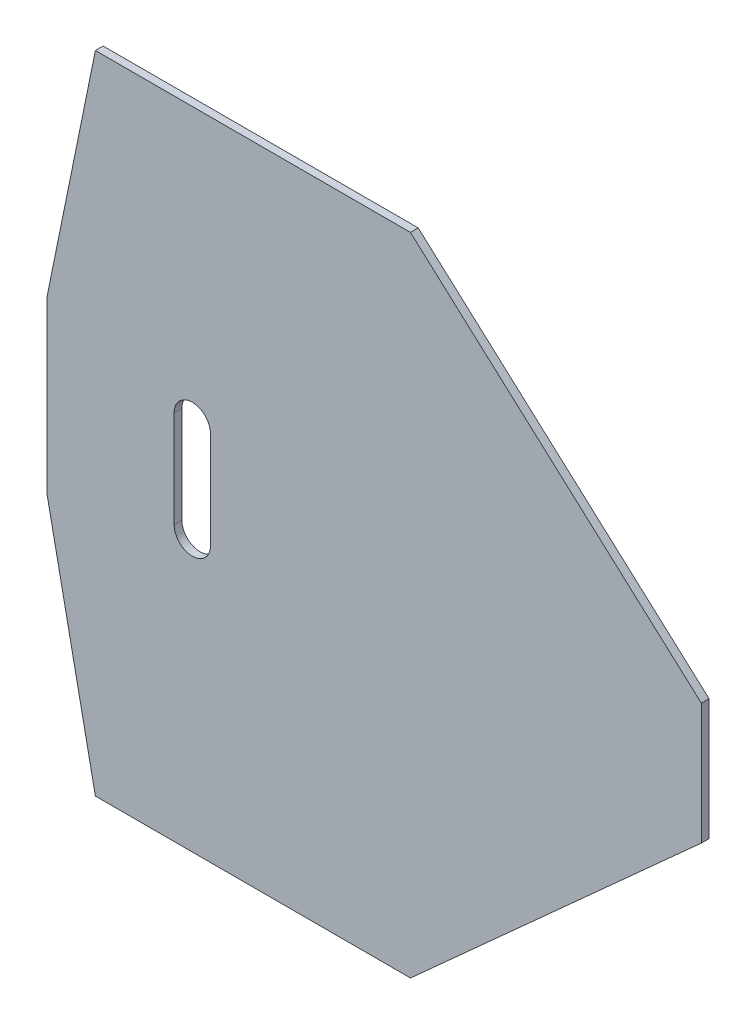
ISO-10303-21;
HEADER;
FILE_DESCRIPTION(('STEP AP214'),'2;1');
FILE_NAME('part.step','',(''),(''),'','','');
FILE_SCHEMA(('AUTOMOTIVE_DESIGN { 1 0 10303 214 1 1 1 1 }'));
ENDSEC;
DATA;
#1=APPLICATION_CONTEXT('core data for automotive mechanical design processes');
#2=APPLICATION_PROTOCOL_DEFINITION('international standard','automotive_design',2000,#1);
#3=PRODUCT_CONTEXT('',#1,'mechanical');
#4=PRODUCT('Part','Part','',(#3));
#5=PRODUCT_RELATED_PRODUCT_CATEGORY('part','',(#4));
#6=PRODUCT_DEFINITION_FORMATION('','',#4);
#7=PRODUCT_DEFINITION_CONTEXT('part definition',#1,'design');
#8=PRODUCT_DEFINITION('design','',#6,#7);
#9=PRODUCT_DEFINITION_SHAPE('','',#8);
#10=(LENGTH_UNIT() NAMED_UNIT(*) SI_UNIT(.MILLI.,.METRE.));
#11=(NAMED_UNIT(*) PLANE_ANGLE_UNIT() SI_UNIT($,.RADIAN.));
#12=(NAMED_UNIT(*) SI_UNIT($,.STERADIAN.) SOLID_ANGLE_UNIT());
#13=UNCERTAINTY_MEASURE_WITH_UNIT(LENGTH_MEASURE(1.E-05),#10,'distance_accuracy_value','');
#14=(GEOMETRIC_REPRESENTATION_CONTEXT(3) GLOBAL_UNCERTAINTY_ASSIGNED_CONTEXT((#13)) GLOBAL_UNIT_ASSIGNED_CONTEXT((#10,
#11,#12)) REPRESENTATION_CONTEXT('',''));
#15=CARTESIAN_POINT('',(0.,0.,0.));
#16=DIRECTION('',(0.,0.,1.));
#17=DIRECTION('',(1.,0.,0.));
#18=AXIS2_PLACEMENT_3D('',#15,#16,#17);
#19=CARTESIAN_POINT('',(190.,55.0000000000005,3.2));
#20=DIRECTION('',(-0.669648314373458,0.742678352355033,0.));
#21=DIRECTION('',(-0.742678352355033,-0.669648314373458,0.));
#22=AXIS2_PLACEMENT_3D('',#19,#20,#21);
#23=PLANE('',#22);
#24=DIRECTION('',(0.742678352355033,0.669648314373458,0.));
#25=VECTOR('',#24,1.);
#26=CARTESIAN_POINT('',(190.,55.0000000000005,0.));
#27=LINE('',#26,#25);
#28=CARTESIAN_POINT('',(69.9999999999996,-53.2000000000005,0.));
#29=VERTEX_POINT('',#28);
#30=CARTESIAN_POINT('',(190.,55.0000000000005,0.));
#31=VERTEX_POINT('',#30);
#32=EDGE_CURVE('E160',#29,#31,#27,.T.);
#33=ORIENTED_EDGE('',*,*,#32,.T.);
#34=DIRECTION('',(0.,0.,-1.));
#35=VECTOR('',#34,1.);
#36=CARTESIAN_POINT('',(190.,55.0000000000005,3.2));
#37=LINE('',#36,#35);
#38=CARTESIAN_POINT('',(190.,55.0000000000005,3.2));
#39=VERTEX_POINT('',#38);
#40=EDGE_CURVE('E11',#39,#31,#37,.T.);
#41=ORIENTED_EDGE('',*,*,#40,.F.);
#42=DIRECTION('',(0.742678352355033,0.669648314373458,0.));
#43=VECTOR('',#42,1.);
#44=CARTESIAN_POINT('',(190.,55.0000000000005,3.2));
#45=LINE('',#44,#43);
#46=CARTESIAN_POINT('',(69.9999999999996,-53.2000000000005,3.2));
#47=VERTEX_POINT('',#46);
#48=EDGE_CURVE('E164',#47,#39,#45,.T.);
#49=ORIENTED_EDGE('',*,*,#48,.F.);
#50=DIRECTION('',(0.,0.,-1.));
#51=VECTOR('',#50,1.);
#52=CARTESIAN_POINT('',(69.9999999999996,-53.2000000000005,3.2));
#53=LINE('',#52,#51);
#54=EDGE_CURVE('E182',#47,#29,#53,.T.);
#55=ORIENTED_EDGE('',*,*,#54,.T.);
#56=EDGE_LOOP('',(#33,#41,#49,#55));
#57=FACE_BOUND('',#56,.T.);
#58=ADVANCED_FACE('F39',(#57),#23,.F.);
#59=CARTESIAN_POINT('',(190.,55.0000000000005,3.2));
#60=DIRECTION('',(-1.,0.,0.));
#61=DIRECTION('',(0.,0.,1.));
#62=AXIS2_PLACEMENT_3D('',#59,#60,#61);
#63=PLANE('',#62);
#64=DIRECTION('',(0.,1.,0.));
#65=VECTOR('',#64,1.);
#66=CARTESIAN_POINT('',(190.,55.0000000000005,0.));
#67=LINE('',#66,#65);
#68=CARTESIAN_POINT('',(190.,105.000000000001,0.));
#69=VERTEX_POINT('',#68);
#70=EDGE_CURVE('E185',#31,#69,#67,.T.);
#71=ORIENTED_EDGE('',*,*,#70,.T.);
#72=DIRECTION('',(0.,0.,-1.));
#73=VECTOR('',#72,1.);
#74=CARTESIAN_POINT('',(190.,105.000000000001,3.2));
#75=LINE('',#74,#73);
#76=CARTESIAN_POINT('',(190.,105.000000000001,3.2));
#77=VERTEX_POINT('',#76);
#78=EDGE_CURVE('E46',#77,#69,#75,.T.);
#79=ORIENTED_EDGE('',*,*,#78,.F.);
#80=DIRECTION('',(0.,1.,0.));
#81=VECTOR('',#80,1.);
#82=CARTESIAN_POINT('',(190.,55.0000000000005,3.2));
#83=LINE('',#82,#81);
#84=EDGE_CURVE('E167',#39,#77,#83,.T.);
#85=ORIENTED_EDGE('',*,*,#84,.F.);
#86=ORIENTED_EDGE('',*,*,#40,.T.);
#87=EDGE_LOOP('',(#71,#79,#85,#86));
#88=FACE_BOUND('',#87,.T.);
#89=ADVANCED_FACE('F240',(#88),#63,.F.);
#90=CARTESIAN_POINT('',(70.0000000000015,213.2,3.2));
#91=DIRECTION('',(-0.669648314373456,-0.742678352355035,0.));
#92=DIRECTION('',(0.742678352355035,-0.669648314373456,0.));
#93=AXIS2_PLACEMENT_3D('',#90,#91,#92);
#94=PLANE('',#93);
#95=DIRECTION('',(-0.742678352355034,0.669648314373456,0.));
#96=VECTOR('',#95,1.);
#97=CARTESIAN_POINT('',(70.0000000000015,213.2,0.));
#98=LINE('',#97,#96);
#99=CARTESIAN_POINT('',(70.0000000000015,213.2,0.));
#100=VERTEX_POINT('',#99);
#101=EDGE_CURVE('E187',#69,#100,#98,.T.);
#102=ORIENTED_EDGE('',*,*,#101,.T.);
#103=DIRECTION('',(0.,0.,-1.));
#104=VECTOR('',#103,1.);
#105=CARTESIAN_POINT('',(70.0000000000015,213.2,3.2));
#106=LINE('',#105,#104);
#107=CARTESIAN_POINT('',(70.0000000000015,213.2,3.2));
#108=VERTEX_POINT('',#107);
#109=EDGE_CURVE('E212',#108,#100,#106,.T.);
#110=ORIENTED_EDGE('',*,*,#109,.F.);
#111=DIRECTION('',(-0.742678352355034,0.669648314373456,0.));
#112=VECTOR('',#111,1.);
#113=CARTESIAN_POINT('',(70.0000000000015,213.2,3.2));
#114=LINE('',#113,#112);
#115=EDGE_CURVE('E170',#77,#108,#114,.T.);
#116=ORIENTED_EDGE('',*,*,#115,.F.);
#117=ORIENTED_EDGE('',*,*,#78,.T.);
#118=EDGE_LOOP('',(#102,#110,#116,#117));
#119=FACE_BOUND('',#118,.T.);
#120=ADVANCED_FACE('F219',(#119),#94,.F.);
#121=CARTESIAN_POINT('',(-59.9999999999985,213.2,3.2));
#122=DIRECTION('',(0.,-1.,0.));
#123=DIRECTION('',(1.,0.,0.));
#124=AXIS2_PLACEMENT_3D('',#121,#122,#123);
#125=PLANE('',#124);
#126=DIRECTION('',(-1.,0.,0.));
#127=VECTOR('',#126,1.);
#128=CARTESIAN_POINT('',(-59.9999999999985,213.2,0.));
#129=LINE('',#128,#127);
#130=CARTESIAN_POINT('',(-59.9999999999985,213.2,0.));
#131=VERTEX_POINT('',#130);
#132=EDGE_CURVE('E189',#100,#131,#129,.T.);
#133=ORIENTED_EDGE('',*,*,#132,.T.);
#134=DIRECTION('',(0.,0.,-1.));
#135=VECTOR('',#134,1.);
#136=CARTESIAN_POINT('',(-59.9999999999985,213.2,3.2));
#137=LINE('',#136,#135);
#138=CARTESIAN_POINT('',(-59.9999999999985,213.2,3.2));
#139=VERTEX_POINT('',#138);
#140=EDGE_CURVE('E209',#139,#131,#137,.T.);
#141=ORIENTED_EDGE('',*,*,#140,.F.);
#142=DIRECTION('',(-1.,0.,0.));
#143=VECTOR('',#142,1.);
#144=CARTESIAN_POINT('',(-59.9999999999985,213.2,3.2));
#145=LINE('',#144,#143);
#146=EDGE_CURVE('E172',#108,#139,#145,.T.);
#147=ORIENTED_EDGE('',*,*,#146,.F.);
#148=ORIENTED_EDGE('',*,*,#109,.T.);
#149=EDGE_LOOP('',(#133,#141,#147,#148));
#150=FACE_BOUND('',#149,.T.);
#151=ADVANCED_FACE('F228',(#150),#125,.F.);
#152=CARTESIAN_POINT('',(-79.9999999999992,115.000000000001,3.2));
#153=DIRECTION('',(0.979883776445382,-0.199568997239393,0.));
#154=DIRECTION('',(0.199568997239393,0.979883776445382,0.));
#155=AXIS2_PLACEMENT_3D('',#152,#153,#154);
#156=PLANE('',#155);
#157=DIRECTION('',(-0.199568997239393,-0.979883776445382,0.));
#158=VECTOR('',#157,1.);
#159=CARTESIAN_POINT('',(-79.9999999999992,115.000000000001,0.));
#160=LINE('',#159,#158);
#161=CARTESIAN_POINT('',(-79.9999999999992,115.000000000001,0.));
#162=VERTEX_POINT('',#161);
#163=EDGE_CURVE('E191',#131,#162,#160,.T.);
#164=ORIENTED_EDGE('',*,*,#163,.T.);
#165=DIRECTION('',(0.,0.,-1.));
#166=VECTOR('',#165,1.);
#167=CARTESIAN_POINT('',(-79.9999999999992,115.000000000001,3.2));
#168=LINE('',#167,#166);
#169=CARTESIAN_POINT('',(-79.9999999999992,115.000000000001,3.2));
#170=VERTEX_POINT('',#169);
#171=EDGE_CURVE('E206',#170,#162,#168,.T.);
#172=ORIENTED_EDGE('',*,*,#171,.F.);
#173=DIRECTION('',(-0.199568997239393,-0.979883776445382,0.));
#174=VECTOR('',#173,1.);
#175=CARTESIAN_POINT('',(-79.9999999999992,115.000000000001,3.2));
#176=LINE('',#175,#174);
#177=EDGE_CURVE('E174',#139,#170,#176,.T.);
#178=ORIENTED_EDGE('',*,*,#177,.F.);
#179=ORIENTED_EDGE('',*,*,#140,.T.);
#180=EDGE_LOOP('',(#164,#172,#178,#179));
#181=FACE_BOUND('',#180,.T.);
#182=ADVANCED_FACE('F232',(#181),#156,.F.);
#183=CARTESIAN_POINT('',(-79.9999999999997,45.0000000000005,3.2));
#184=DIRECTION('',(1.,0.,0.));
#185=DIRECTION('',(0.,1.,0.));
#186=AXIS2_PLACEMENT_3D('',#183,#184,#185);
#187=PLANE('',#186);
#188=DIRECTION('',(0.,-1.,0.));
#189=VECTOR('',#188,1.);
#190=CARTESIAN_POINT('',(-79.9999999999997,45.0000000000005,0.));
#191=LINE('',#190,#189);
#192=CARTESIAN_POINT('',(-79.9999999999997,45.0000000000005,0.));
#193=VERTEX_POINT('',#192);
#194=EDGE_CURVE('E193',#162,#193,#191,.T.);
#195=ORIENTED_EDGE('',*,*,#194,.T.);
#196=DIRECTION('',(0.,0.,-1.));
#197=VECTOR('',#196,1.);
#198=CARTESIAN_POINT('',(-79.9999999999997,45.0000000000005,3.2));
#199=LINE('',#198,#197);
#200=CARTESIAN_POINT('',(-79.9999999999997,45.0000000000005,3.2));
#201=VERTEX_POINT('',#200);
#202=EDGE_CURVE('E203',#201,#193,#199,.T.);
#203=ORIENTED_EDGE('',*,*,#202,.F.);
#204=DIRECTION('',(0.,-1.,0.));
#205=VECTOR('',#204,1.);
#206=CARTESIAN_POINT('',(-79.9999999999997,45.0000000000005,3.2));
#207=LINE('',#206,#205);
#208=EDGE_CURVE('E176',#170,#201,#207,.T.);
#209=ORIENTED_EDGE('',*,*,#208,.F.);
#210=ORIENTED_EDGE('',*,*,#171,.T.);
#211=EDGE_LOOP('',(#195,#203,#209,#210));
#212=FACE_BOUND('',#211,.T.);
#213=ADVANCED_FACE('F253',(#212),#187,.F.);
#214=CARTESIAN_POINT('',(-60.0000000000004,-53.1999999999996,3.2));
#215=DIRECTION('',(0.979883776445385,0.199568997239379,0.));
#216=DIRECTION('',(-0.199568997239379,0.979883776445385,0.));
#217=AXIS2_PLACEMENT_3D('',#214,#215,#216);
#218=PLANE('',#217);
#219=DIRECTION('',(0.199568997239379,-0.979883776445385,0.));
#220=VECTOR('',#219,1.);
#221=CARTESIAN_POINT('',(-60.0000000000004,-53.1999999999996,0.));
#222=LINE('',#221,#220);
#223=CARTESIAN_POINT('',(-60.0000000000004,-53.1999999999996,0.));
#224=VERTEX_POINT('',#223);
#225=EDGE_CURVE('E195',#193,#224,#222,.T.);
#226=ORIENTED_EDGE('',*,*,#225,.T.);
#227=DIRECTION('',(0.,0.,-1.));
#228=VECTOR('',#227,1.);
#229=CARTESIAN_POINT('',(-60.0000000000004,-53.1999999999996,3.2));
#230=LINE('',#229,#228);
#231=CARTESIAN_POINT('',(-60.0000000000004,-53.1999999999996,3.2));
#232=VERTEX_POINT('',#231);
#233=EDGE_CURVE('E200',#232,#224,#230,.T.);
#234=ORIENTED_EDGE('',*,*,#233,.F.);
#235=DIRECTION('',(0.199568997239379,-0.979883776445385,0.));
#236=VECTOR('',#235,1.);
#237=CARTESIAN_POINT('',(-60.0000000000004,-53.1999999999996,3.2));
#238=LINE('',#237,#236);
#239=EDGE_CURVE('E178',#201,#232,#238,.T.);
#240=ORIENTED_EDGE('',*,*,#239,.F.);
#241=ORIENTED_EDGE('',*,*,#202,.T.);
#242=EDGE_LOOP('',(#226,#234,#240,#241));
#243=FACE_BOUND('',#242,.T.);
#244=ADVANCED_FACE('F251',(#243),#218,.F.);
#245=CARTESIAN_POINT('',(69.9999999999996,-53.2000000000005,3.2));
#246=DIRECTION('',(0.,1.,0.));
#247=DIRECTION('',(-1.,0.,0.));
#248=AXIS2_PLACEMENT_3D('',#245,#246,#247);
#249=PLANE('',#248);
#250=DIRECTION('',(1.,0.,0.));
#251=VECTOR('',#250,1.);
#252=CARTESIAN_POINT('',(69.9999999999996,-53.2000000000005,0.));
#253=LINE('',#252,#251);
#254=EDGE_CURVE('E168',#224,#29,#253,.T.);
#255=ORIENTED_EDGE('',*,*,#254,.T.);
#256=ORIENTED_EDGE('',*,*,#54,.F.);
#257=DIRECTION('',(1.,0.,0.));
#258=VECTOR('',#257,1.);
#259=CARTESIAN_POINT('',(69.9999999999996,-53.2000000000005,3.2));
#260=LINE('',#259,#258);
#261=EDGE_CURVE('E180',#232,#47,#260,.T.);
#262=ORIENTED_EDGE('',*,*,#261,.F.);
#263=ORIENTED_EDGE('',*,*,#233,.T.);
#264=EDGE_LOOP('',(#255,#256,#262,#263));
#265=FACE_BOUND('',#264,.T.);
#266=ADVANCED_FACE('F246',(#265),#249,.F.);
#267=CARTESIAN_POINT('',(0.,0.,3.2));
#268=DIRECTION('',(0.,0.,1.));
#269=DIRECTION('',(1.,0.,0.));
#270=AXIS2_PLACEMENT_3D('',#267,#268,#269);
#271=PLANE('',#270);
#272=CARTESIAN_POINT('',(-19.9999999999997,60.0000000000005,3.2));
#273=DIRECTION('',(0.,0.,1.));
#274=DIRECTION('',(1.,0.,0.));
#275=AXIS2_PLACEMENT_3D('',#272,#273,#274);
#276=CIRCLE('',#275,7.5);
#277=CARTESIAN_POINT('',(-27.4999999999997,60.0000000000005,3.2));
#278=VERTEX_POINT('',#277);
#279=CARTESIAN_POINT('',(-12.4999999999997,60.0000000000005,3.2));
#280=VERTEX_POINT('',#279);
#281=EDGE_CURVE('E53',#278,#280,#276,.T.);
#282=ORIENTED_EDGE('',*,*,#281,.F.);
#283=DIRECTION('',(0.,-1.,0.));
#284=VECTOR('',#283,1.);
#285=CARTESIAN_POINT('',(-27.4999999999997,60.0000000000005,3.2));
#286=LINE('',#285,#284);
#287=CARTESIAN_POINT('',(-27.4999999999997,100.000000000001,3.2));
#288=VERTEX_POINT('',#287);
#289=EDGE_CURVE('E145',#288,#278,#286,.T.);
#290=ORIENTED_EDGE('',*,*,#289,.F.);
#291=CARTESIAN_POINT('',(-19.9999999999997,100.000000000001,3.2));
#292=DIRECTION('',(0.,0.,1.));
#293=DIRECTION('',(1.,0.,0.));
#294=AXIS2_PLACEMENT_3D('',#291,#292,#293);
#295=CIRCLE('',#294,7.5);
#296=CARTESIAN_POINT('',(-12.4999999999997,100.000000000001,3.2));
#297=VERTEX_POINT('',#296);
#298=EDGE_CURVE('E148',#297,#288,#295,.T.);
#299=ORIENTED_EDGE('',*,*,#298,.F.);
#300=DIRECTION('',(0.,1.,0.));
#301=VECTOR('',#300,1.);
#302=CARTESIAN_POINT('',(-12.4999999999997,60.0000000000005,3.2));
#303=LINE('',#302,#301);
#304=EDGE_CURVE('E154',#280,#297,#303,.T.);
#305=ORIENTED_EDGE('',*,*,#304,.F.);
#306=EDGE_LOOP('',(#282,#290,#299,#305));
#307=FACE_BOUND('',#306,.T.);
#308=ORIENTED_EDGE('',*,*,#48,.T.);
#309=ORIENTED_EDGE('',*,*,#84,.T.);
#310=ORIENTED_EDGE('',*,*,#115,.T.);
#311=ORIENTED_EDGE('',*,*,#146,.T.);
#312=ORIENTED_EDGE('',*,*,#177,.T.);
#313=ORIENTED_EDGE('',*,*,#208,.T.);
#314=ORIENTED_EDGE('',*,*,#239,.T.);
#315=ORIENTED_EDGE('',*,*,#261,.T.);
#316=EDGE_LOOP('',(#308,#309,#310,#311,#312,#313,#314,#315));
#317=FACE_BOUND('',#316,.T.);
#318=ADVANCED_FACE('F236',(#307,#317),#271,.T.);
#319=CARTESIAN_POINT('',(0.,0.,0.));
#320=DIRECTION('',(0.,0.,1.));
#321=DIRECTION('',(1.,0.,0.));
#322=AXIS2_PLACEMENT_3D('',#319,#320,#321);
#323=PLANE('',#322);
#324=DIRECTION('',(0.,-1.,0.));
#325=VECTOR('',#324,1.);
#326=CARTESIAN_POINT('',(-27.4999999999997,60.0000000000005,0.));
#327=LINE('',#326,#325);
#328=CARTESIAN_POINT('',(-27.4999999999997,100.000000000001,0.));
#329=VERTEX_POINT('',#328);
#330=CARTESIAN_POINT('',(-27.4999999999997,60.0000000000005,0.));
#331=VERTEX_POINT('',#330);
#332=EDGE_CURVE('E135',#329,#331,#327,.T.);
#333=ORIENTED_EDGE('',*,*,#332,.T.);
#334=CARTESIAN_POINT('',(-19.9999999999997,60.0000000000005,0.));
#335=DIRECTION('',(0.,0.,1.));
#336=DIRECTION('',(1.,0.,0.));
#337=AXIS2_PLACEMENT_3D('',#334,#335,#336);
#338=CIRCLE('',#337,7.5);
#339=CARTESIAN_POINT('',(-12.4999999999997,60.0000000000005,0.));
#340=VERTEX_POINT('',#339);
#341=EDGE_CURVE('E129',#331,#340,#338,.T.);
#342=ORIENTED_EDGE('',*,*,#341,.T.);
#343=DIRECTION('',(0.,1.,0.));
#344=VECTOR('',#343,1.);
#345=CARTESIAN_POINT('',(-12.4999999999997,60.0000000000005,0.));
#346=LINE('',#345,#344);
#347=CARTESIAN_POINT('',(-12.4999999999997,100.000000000001,0.));
#348=VERTEX_POINT('',#347);
#349=EDGE_CURVE('E138',#340,#348,#346,.T.);
#350=ORIENTED_EDGE('',*,*,#349,.T.);
#351=CARTESIAN_POINT('',(-19.9999999999997,100.000000000001,0.));
#352=DIRECTION('',(0.,0.,1.));
#353=DIRECTION('',(1.,0.,0.));
#354=AXIS2_PLACEMENT_3D('',#351,#352,#353);
#355=CIRCLE('',#354,7.5);
#356=EDGE_CURVE('E61',#348,#329,#355,.T.);
#357=ORIENTED_EDGE('',*,*,#356,.T.);
#358=EDGE_LOOP('',(#333,#342,#350,#357));
#359=FACE_BOUND('',#358,.T.);
#360=ORIENTED_EDGE('',*,*,#32,.F.);
#361=ORIENTED_EDGE('',*,*,#254,.F.);
#362=ORIENTED_EDGE('',*,*,#225,.F.);
#363=ORIENTED_EDGE('',*,*,#194,.F.);
#364=ORIENTED_EDGE('',*,*,#163,.F.);
#365=ORIENTED_EDGE('',*,*,#132,.F.);
#366=ORIENTED_EDGE('',*,*,#101,.F.);
#367=ORIENTED_EDGE('',*,*,#70,.F.);
#368=EDGE_LOOP('',(#360,#361,#362,#363,#364,#365,#366,#367));
#369=FACE_BOUND('',#368,.T.);
#370=ADVANCED_FACE('F142',(#359,#369),#323,.F.);
#371=CARTESIAN_POINT('',(-19.9999999999997,60.0000000000005,0.));
#372=DIRECTION('',(0.,0.,1.));
#373=DIRECTION('',(1.,0.,0.));
#374=AXIS2_PLACEMENT_3D('',#371,#372,#373);
#375=CYLINDRICAL_SURFACE('',#374,7.5);
#376=ORIENTED_EDGE('',*,*,#281,.T.);
#377=DIRECTION('',(0.,0.,1.));
#378=VECTOR('',#377,1.);
#379=CARTESIAN_POINT('',(-12.4999999999997,60.0000000000005,0.));
#380=LINE('',#379,#378);
#381=EDGE_CURVE('E125',#340,#280,#380,.T.);
#382=ORIENTED_EDGE('',*,*,#381,.F.);
#383=ORIENTED_EDGE('',*,*,#341,.F.);
#384=DIRECTION('',(0.,0.,1.));
#385=VECTOR('',#384,1.);
#386=CARTESIAN_POINT('',(-27.4999999999997,60.0000000000005,0.));
#387=LINE('',#386,#385);
#388=EDGE_CURVE('E158',#331,#278,#387,.T.);
#389=ORIENTED_EDGE('',*,*,#388,.T.);
#390=EDGE_LOOP('',(#376,#382,#383,#389));
#391=FACE_BOUND('',#390,.T.);
#392=ADVANCED_FACE('F127',(#391),#375,.F.);
#393=CARTESIAN_POINT('',(-27.4999999999997,60.0000000000005,0.));
#394=DIRECTION('',(-1.,0.,0.));
#395=DIRECTION('',(0.,0.,1.));
#396=AXIS2_PLACEMENT_3D('',#393,#394,#395);
#397=PLANE('',#396);
#398=ORIENTED_EDGE('',*,*,#289,.T.);
#399=ORIENTED_EDGE('',*,*,#388,.F.);
#400=ORIENTED_EDGE('',*,*,#332,.F.);
#401=DIRECTION('',(0.,0.,1.));
#402=VECTOR('',#401,1.);
#403=CARTESIAN_POINT('',(-27.4999999999997,100.000000000001,0.));
#404=LINE('',#403,#402);
#405=EDGE_CURVE('E161',#329,#288,#404,.T.);
#406=ORIENTED_EDGE('',*,*,#405,.T.);
#407=EDGE_LOOP('',(#398,#399,#400,#406));
#408=FACE_BOUND('',#407,.T.);
#409=ADVANCED_FACE('F330',(#408),#397,.F.);
#410=CARTESIAN_POINT('',(-19.9999999999997,100.000000000001,0.));
#411=DIRECTION('',(0.,0.,1.));
#412=DIRECTION('',(1.,0.,0.));
#413=AXIS2_PLACEMENT_3D('',#410,#411,#412);
#414=CYLINDRICAL_SURFACE('',#413,7.5);
#415=ORIENTED_EDGE('',*,*,#298,.T.);
#416=ORIENTED_EDGE('',*,*,#405,.F.);
#417=ORIENTED_EDGE('',*,*,#356,.F.);
#418=DIRECTION('',(0.,0.,1.));
#419=VECTOR('',#418,1.);
#420=CARTESIAN_POINT('',(-12.4999999999997,100.000000000001,0.));
#421=LINE('',#420,#419);
#422=EDGE_CURVE('E134',#348,#297,#421,.T.);
#423=ORIENTED_EDGE('',*,*,#422,.T.);
#424=EDGE_LOOP('',(#415,#416,#417,#423));
#425=FACE_BOUND('',#424,.T.);
#426=ADVANCED_FACE('F340',(#425),#414,.F.);
#427=CARTESIAN_POINT('',(-12.4999999999997,60.0000000000005,0.));
#428=DIRECTION('',(1.,0.,0.));
#429=DIRECTION('',(0.,0.,-1.));
#430=AXIS2_PLACEMENT_3D('',#427,#428,#429);
#431=PLANE('',#430);
#432=ORIENTED_EDGE('',*,*,#304,.T.);
#433=ORIENTED_EDGE('',*,*,#422,.F.);
#434=ORIENTED_EDGE('',*,*,#349,.F.);
#435=ORIENTED_EDGE('',*,*,#381,.T.);
#436=EDGE_LOOP('',(#432,#433,#434,#435));
#437=FACE_BOUND('',#436,.T.);
#438=ADVANCED_FACE('F139',(#437),#431,.F.);
#439=CLOSED_SHELL('',(#58,#89,#120,#151,#182,#213,#244,#266,#318,#370,#392,#409,#426,#438));
#440=MANIFOLD_SOLID_BREP('B2',#439);
#441=ADVANCED_BREP_SHAPE_REPRESENTATION('',(#18,#440),#14);
#442=SHAPE_DEFINITION_REPRESENTATION(#9,#441);
ENDSEC;
END-ISO-10303-21;
